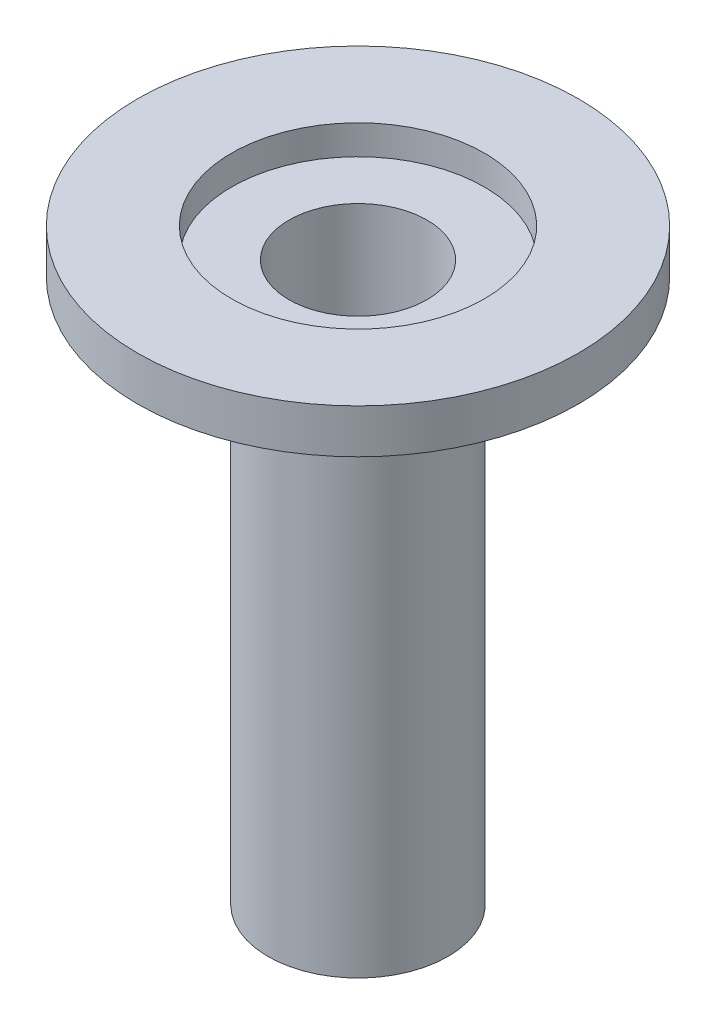
ISO-10303-21;
HEADER;
FILE_DESCRIPTION(('STEP AP214'),'2;1');
FILE_NAME('part.step','',(''),(''),'','','');
FILE_SCHEMA(('AUTOMOTIVE_DESIGN { 1 0 10303 214 1 1 1 1 }'));
ENDSEC;
DATA;
#1=APPLICATION_CONTEXT('core data for automotive mechanical design processes');
#2=APPLICATION_PROTOCOL_DEFINITION('international standard','automotive_design',2000,#1);
#3=PRODUCT_CONTEXT('',#1,'mechanical');
#4=PRODUCT('Part','Part','',(#3));
#5=PRODUCT_RELATED_PRODUCT_CATEGORY('part','',(#4));
#6=PRODUCT_DEFINITION_FORMATION('','',#4);
#7=PRODUCT_DEFINITION_CONTEXT('part definition',#1,'design');
#8=PRODUCT_DEFINITION('design','',#6,#7);
#9=PRODUCT_DEFINITION_SHAPE('','',#8);
#10=(LENGTH_UNIT() NAMED_UNIT(*) SI_UNIT(.MILLI.,.METRE.));
#11=(NAMED_UNIT(*) PLANE_ANGLE_UNIT() SI_UNIT($,.RADIAN.));
#12=(NAMED_UNIT(*) SI_UNIT($,.STERADIAN.) SOLID_ANGLE_UNIT());
#13=UNCERTAINTY_MEASURE_WITH_UNIT(LENGTH_MEASURE(1.E-05),#10,'distance_accuracy_value','');
#14=(GEOMETRIC_REPRESENTATION_CONTEXT(3) GLOBAL_UNCERTAINTY_ASSIGNED_CONTEXT((#13)) GLOBAL_UNIT_ASSIGNED_CONTEXT((#10,
#11,#12)) REPRESENTATION_CONTEXT('',''));
#15=CARTESIAN_POINT('',(0.,0.,0.));
#16=DIRECTION('',(0.,0.,1.));
#17=DIRECTION('',(1.,0.,0.));
#18=AXIS2_PLACEMENT_3D('',#15,#16,#17);
#19=CARTESIAN_POINT('',(0.,0.,0.));
#20=DIRECTION('',(0.,-1.,0.));
#21=DIRECTION('',(0.,0.,-1.));
#22=AXIS2_PLACEMENT_3D('',#19,#20,#21);
#23=PLANE('',#22);
#24=CARTESIAN_POINT('',(0.,0.,0.));
#25=DIRECTION('',(0.,1.,0.));
#26=DIRECTION('',(1.,0.,0.));
#27=AXIS2_PLACEMENT_3D('',#24,#25,#26);
#28=CIRCLE('',#27,8.6);
#29=CARTESIAN_POINT('',(8.6,0.,0.));
#30=VERTEX_POINT('',#29);
#31=EDGE_CURVE('E111',#30,#30,#28,.T.);
#32=ORIENTED_EDGE('',*,*,#31,.F.);
#33=EDGE_LOOP('',(#32));
#34=FACE_BOUND('',#33,.T.);
#35=CARTESIAN_POINT('',(0.,0.,0.));
#36=DIRECTION('',(0.,-1.,0.));
#37=DIRECTION('',(1.,0.,0.));
#38=AXIS2_PLACEMENT_3D('',#35,#36,#37);
#39=CIRCLE('',#38,15.);
#40=CARTESIAN_POINT('',(15.,0.,0.));
#41=VERTEX_POINT('',#40);
#42=EDGE_CURVE('E11',#41,#41,#39,.T.);
#43=ORIENTED_EDGE('',*,*,#42,.F.);
#44=EDGE_LOOP('',(#43));
#45=FACE_BOUND('',#44,.T.);
#46=ADVANCED_FACE('F17',(#34,#45),#23,.F.);
#47=CARTESIAN_POINT('',(0.,2.,0.));
#48=DIRECTION('',(0.,-1.,0.));
#49=DIRECTION('',(-1.,0.,0.));
#50=AXIS2_PLACEMENT_3D('',#47,#48,#49);
#51=CYLINDRICAL_SURFACE('',#50,15.);
#52=CARTESIAN_POINT('',(0.,-3.,0.));
#53=DIRECTION('',(0.,-1.,0.));
#54=DIRECTION('',(1.,0.,0.));
#55=AXIS2_PLACEMENT_3D('',#52,#53,#54);
#56=CIRCLE('',#55,15.);
#57=CARTESIAN_POINT('',(-15.,-3.,0.));
#58=VERTEX_POINT('',#57);
#59=CARTESIAN_POINT('',(15.,-3.,0.));
#60=VERTEX_POINT('',#59);
#61=EDGE_CURVE('E84',#58,#60,#56,.T.);
#62=ORIENTED_EDGE('',*,*,#61,.F.);
#63=CARTESIAN_POINT('',(0.,-3.,0.));
#64=DIRECTION('',(0.,-1.,0.));
#65=DIRECTION('',(1.,0.,0.));
#66=AXIS2_PLACEMENT_3D('',#63,#64,#65);
#67=CIRCLE('',#66,15.);
#68=EDGE_CURVE('E102',#60,#58,#67,.T.);
#69=ORIENTED_EDGE('',*,*,#68,.F.);
#70=DIRECTION('',(0.,1.,0.));
#71=VECTOR('',#70,1.);
#72=CARTESIAN_POINT('',(15.,2.,0.));
#73=LINE('',#72,#71);
#74=EDGE_CURVE('E27',#60,#41,#73,.T.);
#75=ORIENTED_EDGE('',*,*,#74,.T.);
#76=ORIENTED_EDGE('',*,*,#42,.T.);
#77=ORIENTED_EDGE('',*,*,#74,.F.);
#78=EDGE_LOOP('',(#62,#69,#75,#76,#77));
#79=FACE_BOUND('',#78,.T.);
#80=ADVANCED_FACE('F178',(#79),#51,.T.);
#81=CARTESIAN_POINT('',(0.,-4.115,0.));
#82=DIRECTION('',(0.,1.,0.));
#83=DIRECTION('',(1.,0.,0.));
#84=AXIS2_PLACEMENT_3D('',#81,#82,#83);
#85=CONICAL_SURFACE('',#84,10.83876334956,1.30899693899575);
#86=ORIENTED_EDGE('',*,*,#61,.T.);
#87=ORIENTED_EDGE('',*,*,#68,.T.);
#88=DIRECTION('',(0.965925826289068,-0.258819045102521,0.));
#89=VECTOR('',#88,1.);
#90=CARTESIAN_POINT('',(-10.83876334956,-4.115,0.));
#91=LINE('',#90,#89);
#92=CARTESIAN_POINT('',(-6.677526699121,-5.23,0.));
#93=VERTEX_POINT('',#92);
#94=EDGE_CURVE('E64',#58,#93,#91,.T.);
#95=ORIENTED_EDGE('',*,*,#94,.T.);
#96=CARTESIAN_POINT('',(0.,-5.23,0.));
#97=DIRECTION('',(0.,-1.,0.));
#98=DIRECTION('',(1.,0.,0.));
#99=AXIS2_PLACEMENT_3D('',#96,#97,#98);
#100=CIRCLE('',#99,6.677526699121);
#101=EDGE_CURVE('E78',#93,#93,#100,.T.);
#102=ORIENTED_EDGE('',*,*,#101,.F.);
#103=ORIENTED_EDGE('',*,*,#94,.F.);
#104=EDGE_LOOP('',(#86,#87,#95,#102,#103));
#105=FACE_BOUND('',#104,.T.);
#106=ADVANCED_FACE('F183',(#105),#85,.T.);
#107=CARTESIAN_POINT('',(0.,-5.23,0.));
#108=DIRECTION('',(0.,-1.,0.));
#109=DIRECTION('',(0.,0.,-1.));
#110=AXIS2_PLACEMENT_3D('',#107,#108,#109);
#111=PLANE('',#110);
#112=CARTESIAN_POINT('',(0.,-5.23,0.));
#113=DIRECTION('',(0.,-1.,0.));
#114=DIRECTION('',(1.,0.,0.));
#115=AXIS2_PLACEMENT_3D('',#112,#113,#114);
#116=CIRCLE('',#115,6.125);
#117=CARTESIAN_POINT('',(6.125,-5.23,0.));
#118=VERTEX_POINT('',#117);
#119=EDGE_CURVE('E20',#118,#118,#116,.T.);
#120=ORIENTED_EDGE('',*,*,#119,.F.);
#121=EDGE_LOOP('',(#120));
#122=FACE_BOUND('',#121,.T.);
#123=ORIENTED_EDGE('',*,*,#101,.T.);
#124=EDGE_LOOP('',(#123));
#125=FACE_BOUND('',#124,.T.);
#126=ADVANCED_FACE('F190',(#122,#125),#111,.T.);
#127=CARTESIAN_POINT('',(0.,2.,0.));
#128=DIRECTION('',(0.,-1.,0.));
#129=DIRECTION('',(-1.,0.,0.));
#130=AXIS2_PLACEMENT_3D('',#127,#128,#129);
#131=CYLINDRICAL_SURFACE('',#130,6.125);
#132=CARTESIAN_POINT('',(0.,-40.,0.));
#133=DIRECTION('',(0.,-1.,0.));
#134=DIRECTION('',(1.,0.,0.));
#135=AXIS2_PLACEMENT_3D('',#132,#133,#134);
#136=CIRCLE('',#135,6.125);
#137=CARTESIAN_POINT('',(6.125,-40.,0.));
#138=VERTEX_POINT('',#137);
#139=EDGE_CURVE('E86',#138,#138,#136,.T.);
#140=ORIENTED_EDGE('',*,*,#139,.F.);
#141=DIRECTION('',(0.,1.,0.));
#142=VECTOR('',#141,1.);
#143=CARTESIAN_POINT('',(6.125,2.,0.));
#144=LINE('',#143,#142);
#145=EDGE_CURVE('E74',#138,#118,#144,.T.);
#146=ORIENTED_EDGE('',*,*,#145,.T.);
#147=ORIENTED_EDGE('',*,*,#119,.T.);
#148=ORIENTED_EDGE('',*,*,#145,.F.);
#149=EDGE_LOOP('',(#140,#146,#147,#148));
#150=FACE_BOUND('',#149,.T.);
#151=ADVANCED_FACE('F73',(#150),#131,.T.);
#152=CARTESIAN_POINT('',(0.,-40.,0.));
#153=DIRECTION('',(0.,-1.,0.));
#154=DIRECTION('',(0.,0.,-1.));
#155=AXIS2_PLACEMENT_3D('',#152,#153,#154);
#156=PLANE('',#155);
#157=CARTESIAN_POINT('',(0.,-40.,0.));
#158=DIRECTION('',(0.,-1.,0.));
#159=DIRECTION('',(1.,0.,0.));
#160=AXIS2_PLACEMENT_3D('',#157,#158,#159);
#161=CIRCLE('',#160,5.5);
#162=CARTESIAN_POINT('',(5.5,-40.,0.));
#163=VERTEX_POINT('',#162);
#164=EDGE_CURVE('E91',#163,#163,#161,.T.);
#165=ORIENTED_EDGE('',*,*,#164,.F.);
#166=EDGE_LOOP('',(#165));
#167=FACE_BOUND('',#166,.T.);
#168=ORIENTED_EDGE('',*,*,#139,.T.);
#169=EDGE_LOOP('',(#168));
#170=FACE_BOUND('',#169,.T.);
#171=ADVANCED_FACE('F197',(#167,#170),#156,.T.);
#172=CARTESIAN_POINT('',(0.,-22.88002992512,0.));
#173=DIRECTION('',(0.,-1.,0.));
#174=DIRECTION('',(-1.,0.,0.));
#175=AXIS2_PLACEMENT_3D('',#172,#173,#174);
#176=CYLINDRICAL_SURFACE('',#175,5.5);
#177=CARTESIAN_POINT('',(0.,-27.,0.));
#178=DIRECTION('',(0.,-1.,0.));
#179=DIRECTION('',(-1.,0.,0.));
#180=AXIS2_PLACEMENT_3D('',#177,#178,#179);
#181=CIRCLE('',#180,5.5);
#182=CARTESIAN_POINT('',(5.5,-27.,0.));
#183=VERTEX_POINT('',#182);
#184=EDGE_CURVE('E115',#183,#183,#181,.T.);
#185=ORIENTED_EDGE('',*,*,#184,.F.);
#186=DIRECTION('',(0.,-1.,0.));
#187=VECTOR('',#186,1.);
#188=CARTESIAN_POINT('',(5.5,-22.88002992512,0.));
#189=LINE('',#188,#187);
#190=EDGE_CURVE('E118',#183,#163,#189,.T.);
#191=ORIENTED_EDGE('',*,*,#190,.T.);
#192=ORIENTED_EDGE('',*,*,#164,.T.);
#193=ORIENTED_EDGE('',*,*,#190,.F.);
#194=EDGE_LOOP('',(#185,#191,#192,#193));
#195=FACE_BOUND('',#194,.T.);
#196=ADVANCED_FACE('F202',(#195),#176,.F.);
#197=CARTESIAN_POINT('',(0.,-26.75965575239,0.));
#198=DIRECTION('',(0.,-1.,0.));
#199=DIRECTION('',(-1.,0.,0.));
#200=AXIS2_PLACEMENT_3D('',#197,#198,#199);
#201=CONICAL_SURFACE('',#200,5.1,1.02974425867665);
#202=CARTESIAN_POINT('',(0.,-26.51931150478,0.));
#203=DIRECTION('',(0.,-1.,0.));
#204=DIRECTION('',(1.,0.,0.));
#205=AXIS2_PLACEMENT_3D('',#202,#203,#204);
#206=CIRCLE('',#205,4.7);
#207=CARTESIAN_POINT('',(4.7,-26.51931150478,0.));
#208=VERTEX_POINT('',#207);
#209=EDGE_CURVE('E96',#208,#208,#206,.T.);
#210=ORIENTED_EDGE('',*,*,#209,.F.);
#211=DIRECTION('',(0.857167300702112,-0.515038074910054,0.));
#212=VECTOR('',#211,1.);
#213=CARTESIAN_POINT('',(5.1,-26.75965575239,0.));
#214=LINE('',#213,#212);
#215=EDGE_CURVE('E100',#208,#183,#214,.T.);
#216=ORIENTED_EDGE('',*,*,#215,.T.);
#217=ORIENTED_EDGE('',*,*,#184,.T.);
#218=ORIENTED_EDGE('',*,*,#215,.F.);
#219=EDGE_LOOP('',(#210,#216,#217,#218));
#220=FACE_BOUND('',#219,.T.);
#221=ADVANCED_FACE('F173',(#220),#201,.F.);
#222=CARTESIAN_POINT('',(0.,2.,0.));
#223=DIRECTION('',(0.,-1.,0.));
#224=DIRECTION('',(-1.,0.,0.));
#225=AXIS2_PLACEMENT_3D('',#222,#223,#224);
#226=CYLINDRICAL_SURFACE('',#225,4.7);
#227=CARTESIAN_POINT('',(0.,-2.,0.));
#228=DIRECTION('',(0.,-1.,0.));
#229=DIRECTION('',(1.,0.,0.));
#230=AXIS2_PLACEMENT_3D('',#227,#228,#229);
#231=CIRCLE('',#230,4.7);
#232=CARTESIAN_POINT('',(4.7,-2.,0.));
#233=VERTEX_POINT('',#232);
#234=EDGE_CURVE('E142',#233,#233,#231,.T.);
#235=ORIENTED_EDGE('',*,*,#234,.F.);
#236=DIRECTION('',(0.,-1.,0.));
#237=VECTOR('',#236,1.);
#238=CARTESIAN_POINT('',(4.7,2.,0.));
#239=LINE('',#238,#237);
#240=EDGE_CURVE('E101',#233,#208,#239,.T.);
#241=ORIENTED_EDGE('',*,*,#240,.T.);
#242=ORIENTED_EDGE('',*,*,#209,.T.);
#243=ORIENTED_EDGE('',*,*,#240,.F.);
#244=EDGE_LOOP('',(#235,#241,#242,#243));
#245=FACE_BOUND('',#244,.T.);
#246=ADVANCED_FACE('F166',(#245),#226,.F.);
#247=CARTESIAN_POINT('',(0.,-2.,0.));
#248=DIRECTION('',(0.,-1.,0.));
#249=DIRECTION('',(0.,0.,-1.));
#250=AXIS2_PLACEMENT_3D('',#247,#248,#249);
#251=PLANE('',#250);
#252=ORIENTED_EDGE('',*,*,#234,.T.);
#253=EDGE_LOOP('',(#252));
#254=FACE_BOUND('',#253,.T.);
#255=CARTESIAN_POINT('',(0.,-2.,0.));
#256=DIRECTION('',(0.,-1.,0.));
#257=DIRECTION('',(1.,0.,0.));
#258=AXIS2_PLACEMENT_3D('',#255,#256,#257);
#259=CIRCLE('',#258,8.6);
#260=CARTESIAN_POINT('',(8.6,-2.,0.));
#261=VERTEX_POINT('',#260);
#262=EDGE_CURVE('E95',#261,#261,#259,.T.);
#263=ORIENTED_EDGE('',*,*,#262,.F.);
#264=EDGE_LOOP('',(#263));
#265=FACE_BOUND('',#264,.T.);
#266=ADVANCED_FACE('F164',(#254,#265),#251,.F.);
#267=CARTESIAN_POINT('',(0.,2.,0.));
#268=DIRECTION('',(0.,-1.,0.));
#269=DIRECTION('',(-1.,0.,0.));
#270=AXIS2_PLACEMENT_3D('',#267,#268,#269);
#271=CYLINDRICAL_SURFACE('',#270,8.6);
#272=ORIENTED_EDGE('',*,*,#31,.T.);
#273=DIRECTION('',(0.,-1.,0.));
#274=VECTOR('',#273,1.);
#275=CARTESIAN_POINT('',(8.6,2.,0.));
#276=LINE('',#275,#274);
#277=EDGE_CURVE('E107',#30,#261,#276,.T.);
#278=ORIENTED_EDGE('',*,*,#277,.T.);
#279=ORIENTED_EDGE('',*,*,#262,.T.);
#280=ORIENTED_EDGE('',*,*,#277,.F.);
#281=EDGE_LOOP('',(#272,#278,#279,#280));
#282=FACE_BOUND('',#281,.T.);
#283=ADVANCED_FACE('F159',(#282),#271,.F.);
#284=CLOSED_SHELL('',(#46,#80,#106,#126,#151,#171,#196,#221,#246,#266,#283));
#285=MANIFOLD_SOLID_BREP('B1',#284);
#286=ADVANCED_BREP_SHAPE_REPRESENTATION('',(#18,#285),#14);
#287=SHAPE_DEFINITION_REPRESENTATION(#9,#286);
ENDSEC;
END-ISO-10303-21;
